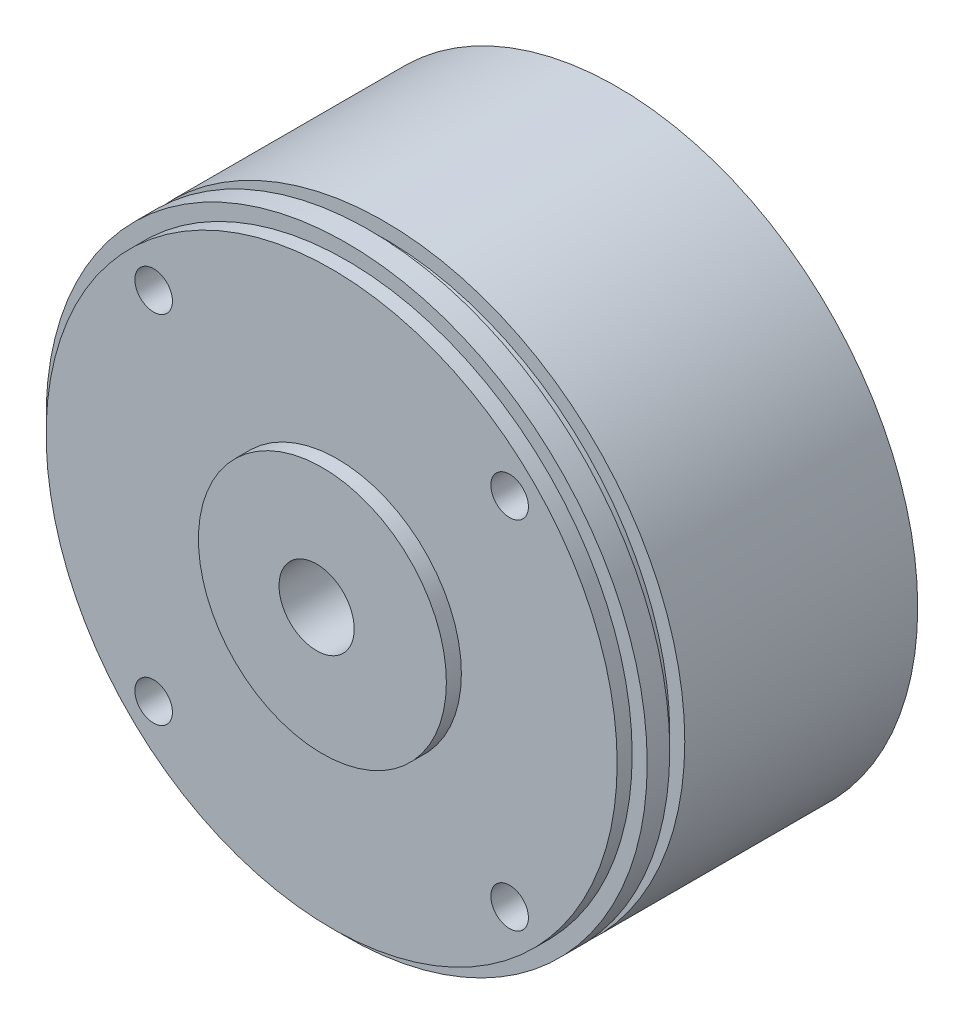
ISO-10303-21;
HEADER;
FILE_DESCRIPTION(('STEP AP214'),'2;1');
FILE_NAME('part.step','',(''),(''),'','','');
FILE_SCHEMA(('AUTOMOTIVE_DESIGN { 1 0 10303 214 1 1 1 1 }'));
ENDSEC;
DATA;
#1=APPLICATION_CONTEXT('core data for automotive mechanical design processes');
#2=APPLICATION_PROTOCOL_DEFINITION('international standard','automotive_design',2000,#1);
#3=PRODUCT_CONTEXT('',#1,'mechanical');
#4=PRODUCT('Part','Part','',(#3));
#5=PRODUCT_RELATED_PRODUCT_CATEGORY('part','',(#4));
#6=PRODUCT_DEFINITION_FORMATION('','',#4);
#7=PRODUCT_DEFINITION_CONTEXT('part definition',#1,'design');
#8=PRODUCT_DEFINITION('design','',#6,#7);
#9=PRODUCT_DEFINITION_SHAPE('','',#8);
#10=(LENGTH_UNIT() NAMED_UNIT(*) SI_UNIT(.MILLI.,.METRE.));
#11=(NAMED_UNIT(*) PLANE_ANGLE_UNIT() SI_UNIT($,.RADIAN.));
#12=(NAMED_UNIT(*) SI_UNIT($,.STERADIAN.) SOLID_ANGLE_UNIT());
#13=UNCERTAINTY_MEASURE_WITH_UNIT(LENGTH_MEASURE(1.E-05),#10,'distance_accuracy_value','');
#14=(GEOMETRIC_REPRESENTATION_CONTEXT(3) GLOBAL_UNCERTAINTY_ASSIGNED_CONTEXT((#13)) GLOBAL_UNIT_ASSIGNED_CONTEXT((#10,
#11,#12)) REPRESENTATION_CONTEXT('',''));
#15=CARTESIAN_POINT('',(0.,0.,0.));
#16=DIRECTION('',(0.,0.,1.));
#17=DIRECTION('',(1.,0.,0.));
#18=AXIS2_PLACEMENT_3D('',#15,#16,#17);
#19=CARTESIAN_POINT('',(0.,0.,20.));
#20=DIRECTION('',(0.,0.,-1.));
#21=DIRECTION('',(-1.,0.,0.));
#22=AXIS2_PLACEMENT_3D('',#19,#20,#21);
#23=CYLINDRICAL_SURFACE('',#22,20.);
#24=CARTESIAN_POINT('',(0.,0.,0.));
#25=DIRECTION('',(0.,0.,1.));
#26=DIRECTION('',(1.,0.,0.));
#27=AXIS2_PLACEMENT_3D('',#24,#25,#26);
#28=CIRCLE('',#27,20.);
#29=CARTESIAN_POINT('',(20.,0.,0.));
#30=VERTEX_POINT('',#29);
#31=EDGE_CURVE('E10',#30,#30,#28,.T.);
#32=ORIENTED_EDGE('',*,*,#31,.T.);
#33=EDGE_LOOP('',(#32));
#34=FACE_BOUND('',#33,.T.);
#35=CARTESIAN_POINT('',(0.,0.,15.5));
#36=DIRECTION('',(0.,0.,1.));
#37=DIRECTION('',(1.,0.,0.));
#38=AXIS2_PLACEMENT_3D('',#35,#36,#37);
#39=CIRCLE('',#38,20.);
#40=CARTESIAN_POINT('',(20.,0.,15.5));
#41=VERTEX_POINT('',#40);
#42=EDGE_CURVE('E111',#41,#41,#39,.T.);
#43=ORIENTED_EDGE('',*,*,#42,.F.);
#44=EDGE_LOOP('',(#43));
#45=FACE_BOUND('',#44,.T.);
#46=ADVANCED_FACE('F39',(#34,#45),#23,.T.);
#47=CARTESIAN_POINT('',(0.,0.,0.));
#48=DIRECTION('',(0.,0.,1.));
#49=DIRECTION('',(1.,0.,0.));
#50=AXIS2_PLACEMENT_3D('',#47,#48,#49);
#51=PLANE('',#50);
#52=CARTESIAN_POINT('',(0.,0.,0.));
#53=DIRECTION('',(0.,0.,1.));
#54=DIRECTION('',(1.,0.,0.));
#55=AXIS2_PLACEMENT_3D('',#52,#53,#54);
#56=CIRCLE('',#55,15.);
#57=CARTESIAN_POINT('',(15.,0.,0.));
#58=VERTEX_POINT('',#57);
#59=EDGE_CURVE('E54',#58,#58,#56,.T.);
#60=ORIENTED_EDGE('',*,*,#59,.T.);
#61=EDGE_LOOP('',(#60));
#62=FACE_BOUND('',#61,.T.);
#63=ORIENTED_EDGE('',*,*,#31,.F.);
#64=EDGE_LOOP('',(#63));
#65=FACE_BOUND('',#64,.T.);
#66=ADVANCED_FACE('F165',(#62,#65),#51,.F.);
#67=CARTESIAN_POINT('',(0.,0.,-0.5));
#68=DIRECTION('',(0.,0.,1.));
#69=DIRECTION('',(1.,0.,0.));
#70=AXIS2_PLACEMENT_3D('',#67,#68,#69);
#71=CYLINDRICAL_SURFACE('',#70,15.);
#72=CARTESIAN_POINT('',(0.,0.,-0.5));
#73=DIRECTION('',(0.,0.,1.));
#74=DIRECTION('',(1.,0.,0.));
#75=AXIS2_PLACEMENT_3D('',#72,#73,#74);
#76=CIRCLE('',#75,15.);
#77=CARTESIAN_POINT('',(15.,0.,-0.5));
#78=VERTEX_POINT('',#77);
#79=EDGE_CURVE('E48',#78,#78,#76,.T.);
#80=ORIENTED_EDGE('',*,*,#79,.T.);
#81=EDGE_LOOP('',(#80));
#82=FACE_BOUND('',#81,.T.);
#83=ORIENTED_EDGE('',*,*,#59,.F.);
#84=EDGE_LOOP('',(#83));
#85=FACE_BOUND('',#84,.T.);
#86=ADVANCED_FACE('F169',(#82,#85),#71,.T.);
#87=CARTESIAN_POINT('',(0.,0.,-0.5));
#88=DIRECTION('',(0.,0.,1.));
#89=DIRECTION('',(1.,0.,0.));
#90=AXIS2_PLACEMENT_3D('',#87,#88,#89);
#91=PLANE('',#90);
#92=CARTESIAN_POINT('',(0.,0.,-0.5));
#93=DIRECTION('',(0.,0.,1.));
#94=DIRECTION('',(1.,0.,0.));
#95=AXIS2_PLACEMENT_3D('',#92,#93,#94);
#96=CIRCLE('',#95,6.3);
#97=CARTESIAN_POINT('',(6.3,0.,-0.5));
#98=VERTEX_POINT('',#97);
#99=EDGE_CURVE('E279',#98,#98,#96,.T.);
#100=ORIENTED_EDGE('',*,*,#99,.T.);
#101=EDGE_LOOP('',(#100));
#102=FACE_BOUND('',#101,.T.);
#103=CARTESIAN_POINT('',(0.,10.,-0.5));
#104=DIRECTION('',(0.,0.,1.));
#105=DIRECTION('',(1.,0.,0.));
#106=AXIS2_PLACEMENT_3D('',#103,#104,#105);
#107=CIRCLE('',#106,1.5);
#108=CARTESIAN_POINT('',(1.5,10.,-0.5));
#109=VERTEX_POINT('',#108);
#110=EDGE_CURVE('E71',#109,#109,#107,.T.);
#111=ORIENTED_EDGE('',*,*,#110,.T.);
#112=EDGE_LOOP('',(#111));
#113=FACE_BOUND('',#112,.T.);
#114=CARTESIAN_POINT('',(10.0000000000003,2.82380124105319E-13,-0.5));
#115=DIRECTION('',(0.,0.,1.));
#116=DIRECTION('',(1.,0.,0.));
#117=AXIS2_PLACEMENT_3D('',#114,#115,#116);
#118=CIRCLE('',#117,1.50000000000022);
#119=CARTESIAN_POINT('',(11.5000000000005,2.82380124105319E-13,-0.5));
#120=VERTEX_POINT('',#119);
#121=EDGE_CURVE('E67',#120,#120,#118,.T.);
#122=ORIENTED_EDGE('',*,*,#121,.T.);
#123=EDGE_LOOP('',(#122));
#124=FACE_BOUND('',#123,.T.);
#125=CARTESIAN_POINT('',(5.64760248210638E-13,-10.,-0.5));
#126=DIRECTION('',(0.,0.,1.));
#127=DIRECTION('',(1.,0.,0.));
#128=AXIS2_PLACEMENT_3D('',#125,#126,#127);
#129=CIRCLE('',#128,1.50000000000061);
#130=CARTESIAN_POINT('',(1.50000000000117,-10.,-0.5));
#131=VERTEX_POINT('',#130);
#132=EDGE_CURVE('E62',#131,#131,#129,.T.);
#133=ORIENTED_EDGE('',*,*,#132,.T.);
#134=EDGE_LOOP('',(#133));
#135=FACE_BOUND('',#134,.T.);
#136=CARTESIAN_POINT('',(-9.99999999999972,-2.83604770904466E-13,-0.5));
#137=DIRECTION('',(0.,0.,1.));
#138=DIRECTION('',(1.,0.,0.));
#139=AXIS2_PLACEMENT_3D('',#136,#137,#138);
#140=CIRCLE('',#139,1.50000000000045);
#141=CARTESIAN_POINT('',(-8.49999999999927,-2.83604770904466E-13,-0.5));
#142=VERTEX_POINT('',#141);
#143=EDGE_CURVE('E58',#142,#142,#140,.T.);
#144=ORIENTED_EDGE('',*,*,#143,.T.);
#145=EDGE_LOOP('',(#144));
#146=FACE_BOUND('',#145,.T.);
#147=ORIENTED_EDGE('',*,*,#79,.F.);
#148=EDGE_LOOP('',(#147));
#149=FACE_BOUND('',#148,.T.);
#150=ADVANCED_FACE('F162',(#102,#113,#124,#135,#146,#149),#91,.F.);
#151=CARTESIAN_POINT('',(-9.99999999999972,-2.83604770904466E-13,-4.));
#152=DIRECTION('',(0.,0.,1.));
#153=DIRECTION('',(1.,0.,0.));
#154=AXIS2_PLACEMENT_3D('',#151,#152,#153);
#155=CYLINDRICAL_SURFACE('',#154,1.50000000000045);
#156=CARTESIAN_POINT('',(-9.99999999999972,-2.83604770904466E-13,4.));
#157=DIRECTION('',(0.,0.,1.));
#158=DIRECTION('',(1.,0.,0.));
#159=AXIS2_PLACEMENT_3D('',#156,#157,#158);
#160=CIRCLE('',#159,1.50000000000045);
#161=CARTESIAN_POINT('',(-8.49999999999927,-2.83604770904466E-13,4.));
#162=VERTEX_POINT('',#161);
#163=EDGE_CURVE('E129',#162,#162,#160,.T.);
#164=ORIENTED_EDGE('',*,*,#163,.T.);
#165=EDGE_LOOP('',(#164));
#166=FACE_BOUND('',#165,.T.);
#167=ORIENTED_EDGE('',*,*,#143,.F.);
#168=EDGE_LOOP('',(#167));
#169=FACE_BOUND('',#168,.T.);
#170=ADVANCED_FACE('F148',(#166,#169),#155,.F.);
#171=CARTESIAN_POINT('',(-9.99999999999972,-2.83604770904466E-13,4.));
#172=DIRECTION('',(0.,0.,1.));
#173=DIRECTION('',(1.,0.,0.));
#174=AXIS2_PLACEMENT_3D('',#171,#172,#173);
#175=PLANE('',#174);
#176=ORIENTED_EDGE('',*,*,#163,.F.);
#177=EDGE_LOOP('',(#176));
#178=FACE_BOUND('',#177,.T.);
#179=ADVANCED_FACE('F151',(#178),#175,.F.);
#180=CARTESIAN_POINT('',(5.64760248210638E-13,-10.,-4.));
#181=DIRECTION('',(0.,0.,1.));
#182=DIRECTION('',(1.,0.,0.));
#183=AXIS2_PLACEMENT_3D('',#180,#181,#182);
#184=CYLINDRICAL_SURFACE('',#183,1.50000000000061);
#185=CARTESIAN_POINT('',(5.64760248210638E-13,-10.,4.));
#186=DIRECTION('',(0.,0.,1.));
#187=DIRECTION('',(1.,0.,0.));
#188=AXIS2_PLACEMENT_3D('',#185,#186,#187);
#189=CIRCLE('',#188,1.50000000000061);
#190=CARTESIAN_POINT('',(1.50000000000117,-10.,4.));
#191=VERTEX_POINT('',#190);
#192=EDGE_CURVE('E140',#191,#191,#189,.T.);
#193=ORIENTED_EDGE('',*,*,#192,.T.);
#194=EDGE_LOOP('',(#193));
#195=FACE_BOUND('',#194,.T.);
#196=ORIENTED_EDGE('',*,*,#132,.F.);
#197=EDGE_LOOP('',(#196));
#198=FACE_BOUND('',#197,.T.);
#199=ADVANCED_FACE('F153',(#195,#198),#184,.F.);
#200=CARTESIAN_POINT('',(5.64760248210638E-13,-10.,4.));
#201=DIRECTION('',(0.,0.,1.));
#202=DIRECTION('',(1.,0.,0.));
#203=AXIS2_PLACEMENT_3D('',#200,#201,#202);
#204=PLANE('',#203);
#205=ORIENTED_EDGE('',*,*,#192,.F.);
#206=EDGE_LOOP('',(#205));
#207=FACE_BOUND('',#206,.T.);
#208=ADVANCED_FACE('F159',(#207),#204,.F.);
#209=CARTESIAN_POINT('',(10.0000000000003,2.82380124105319E-13,-4.));
#210=DIRECTION('',(0.,0.,1.));
#211=DIRECTION('',(1.,0.,0.));
#212=AXIS2_PLACEMENT_3D('',#209,#210,#211);
#213=CYLINDRICAL_SURFACE('',#212,1.50000000000022);
#214=CARTESIAN_POINT('',(10.0000000000003,2.82380124105319E-13,4.));
#215=DIRECTION('',(0.,0.,1.));
#216=DIRECTION('',(1.,0.,0.));
#217=AXIS2_PLACEMENT_3D('',#214,#215,#216);
#218=CIRCLE('',#217,1.50000000000022);
#219=CARTESIAN_POINT('',(11.5000000000005,2.82380124105319E-13,4.));
#220=VERTEX_POINT('',#219);
#221=EDGE_CURVE('E136',#220,#220,#218,.T.);
#222=ORIENTED_EDGE('',*,*,#221,.T.);
#223=EDGE_LOOP('',(#222));
#224=FACE_BOUND('',#223,.T.);
#225=ORIENTED_EDGE('',*,*,#121,.F.);
#226=EDGE_LOOP('',(#225));
#227=FACE_BOUND('',#226,.T.);
#228=ADVANCED_FACE('F228',(#224,#227),#213,.F.);
#229=CARTESIAN_POINT('',(10.0000000000003,2.82380124105319E-13,4.));
#230=DIRECTION('',(0.,0.,1.));
#231=DIRECTION('',(1.,0.,0.));
#232=AXIS2_PLACEMENT_3D('',#229,#230,#231);
#233=PLANE('',#232);
#234=ORIENTED_EDGE('',*,*,#221,.F.);
#235=EDGE_LOOP('',(#234));
#236=FACE_BOUND('',#235,.T.);
#237=ADVANCED_FACE('F224',(#236),#233,.F.);
#238=CARTESIAN_POINT('',(0.,10.,-4.));
#239=DIRECTION('',(0.,0.,1.));
#240=DIRECTION('',(1.,0.,0.));
#241=AXIS2_PLACEMENT_3D('',#238,#239,#240);
#242=CYLINDRICAL_SURFACE('',#241,1.5);
#243=CARTESIAN_POINT('',(0.,10.,4.));
#244=DIRECTION('',(0.,0.,1.));
#245=DIRECTION('',(1.,0.,0.));
#246=AXIS2_PLACEMENT_3D('',#243,#244,#245);
#247=CIRCLE('',#246,1.5);
#248=CARTESIAN_POINT('',(1.5,10.,4.));
#249=VERTEX_POINT('',#248);
#250=EDGE_CURVE('E63',#249,#249,#247,.T.);
#251=ORIENTED_EDGE('',*,*,#250,.T.);
#252=EDGE_LOOP('',(#251));
#253=FACE_BOUND('',#252,.T.);
#254=ORIENTED_EDGE('',*,*,#110,.F.);
#255=EDGE_LOOP('',(#254));
#256=FACE_BOUND('',#255,.T.);
#257=ADVANCED_FACE('F220',(#253,#256),#242,.F.);
#258=CARTESIAN_POINT('',(0.,10.,4.));
#259=DIRECTION('',(0.,0.,1.));
#260=DIRECTION('',(1.,0.,0.));
#261=AXIS2_PLACEMENT_3D('',#258,#259,#260);
#262=PLANE('',#261);
#263=ORIENTED_EDGE('',*,*,#250,.F.);
#264=EDGE_LOOP('',(#263));
#265=FACE_BOUND('',#264,.T.);
#266=ADVANCED_FACE('F203',(#265),#262,.F.);
#267=CARTESIAN_POINT('',(0.,0.,15.5));
#268=DIRECTION('',(0.,0.,1.));
#269=DIRECTION('',(1.,0.,0.));
#270=AXIS2_PLACEMENT_3D('',#267,#268,#269);
#271=PLANE('',#270);
#272=CARTESIAN_POINT('',(0.,0.,15.5));
#273=DIRECTION('',(0.,0.,1.));
#274=DIRECTION('',(1.,0.,0.));
#275=AXIS2_PLACEMENT_3D('',#272,#273,#274);
#276=CIRCLE('',#275,19.);
#277=CARTESIAN_POINT('',(19.,0.,15.5));
#278=VERTEX_POINT('',#277);
#279=EDGE_CURVE('E101',#278,#278,#276,.T.);
#280=ORIENTED_EDGE('',*,*,#279,.F.);
#281=EDGE_LOOP('',(#280));
#282=FACE_BOUND('',#281,.T.);
#283=ORIENTED_EDGE('',*,*,#42,.T.);
#284=EDGE_LOOP('',(#283));
#285=FACE_BOUND('',#284,.T.);
#286=ADVANCED_FACE('F194',(#282,#285),#271,.T.);
#287=CARTESIAN_POINT('',(0.,0.,16.5));
#288=DIRECTION('',(0.,0.,1.));
#289=DIRECTION('',(1.,0.,0.));
#290=AXIS2_PLACEMENT_3D('',#287,#288,#289);
#291=PLANE('',#290);
#292=CARTESIAN_POINT('',(0.,0.,16.5));
#293=DIRECTION('',(0.,0.,1.));
#294=DIRECTION('',(1.,0.,0.));
#295=AXIS2_PLACEMENT_3D('',#292,#293,#294);
#296=CIRCLE('',#295,19.);
#297=CARTESIAN_POINT('',(19.,0.,16.5));
#298=VERTEX_POINT('',#297);
#299=EDGE_CURVE('E96',#298,#298,#296,.T.);
#300=ORIENTED_EDGE('',*,*,#299,.T.);
#301=EDGE_LOOP('',(#300));
#302=FACE_BOUND('',#301,.T.);
#303=CARTESIAN_POINT('',(0.,0.,16.5));
#304=DIRECTION('',(0.,0.,1.));
#305=DIRECTION('',(1.,0.,0.));
#306=AXIS2_PLACEMENT_3D('',#303,#304,#305);
#307=CIRCLE('',#306,20.);
#308=CARTESIAN_POINT('',(20.,0.,16.5));
#309=VERTEX_POINT('',#308);
#310=EDGE_CURVE('E107',#309,#309,#307,.T.);
#311=ORIENTED_EDGE('',*,*,#310,.F.);
#312=EDGE_LOOP('',(#311));
#313=FACE_BOUND('',#312,.T.);
#314=ADVANCED_FACE('F191',(#302,#313),#291,.F.);
#315=CARTESIAN_POINT('',(0.,0.,15.5));
#316=DIRECTION('',(0.,0.,1.));
#317=DIRECTION('',(1.,0.,0.));
#318=AXIS2_PLACEMENT_3D('',#315,#316,#317);
#319=CYLINDRICAL_SURFACE('',#318,19.);
#320=ORIENTED_EDGE('',*,*,#279,.T.);
#321=EDGE_LOOP('',(#320));
#322=FACE_BOUND('',#321,.T.);
#323=ORIENTED_EDGE('',*,*,#299,.F.);
#324=EDGE_LOOP('',(#323));
#325=FACE_BOUND('',#324,.T.);
#326=ADVANCED_FACE('F193',(#322,#325),#319,.T.);
#327=CARTESIAN_POINT('',(0.,0.,20.));
#328=DIRECTION('',(0.,0.,1.));
#329=DIRECTION('',(1.,0.,0.));
#330=AXIS2_PLACEMENT_3D('',#327,#328,#329);
#331=PLANE('',#330);
#332=CARTESIAN_POINT('',(0.,0.,20.));
#333=DIRECTION('',(0.,0.,1.));
#334=DIRECTION('',(1.,0.,0.));
#335=AXIS2_PLACEMENT_3D('',#332,#333,#334);
#336=CIRCLE('',#335,2.5);
#337=CARTESIAN_POINT('',(2.5,0.,20.));
#338=VERTEX_POINT('',#337);
#339=EDGE_CURVE('E266',#338,#338,#336,.T.);
#340=ORIENTED_EDGE('',*,*,#339,.F.);
#341=EDGE_LOOP('',(#340));
#342=FACE_BOUND('',#341,.T.);
#343=CARTESIAN_POINT('',(0.385039993021148,0.,20.));
#344=DIRECTION('',(0.,0.,1.));
#345=DIRECTION('',(1.,0.,0.));
#346=AXIS2_PLACEMENT_3D('',#343,#344,#345);
#347=CIRCLE('',#346,8.25);
#348=CARTESIAN_POINT('',(8.63503999302115,0.,20.));
#349=VERTEX_POINT('',#348);
#350=EDGE_CURVE('E79',#349,#349,#347,.T.);
#351=ORIENTED_EDGE('',*,*,#350,.T.);
#352=EDGE_LOOP('',(#351));
#353=FACE_BOUND('',#352,.T.);
#354=ADVANCED_FACE('F200',(#342,#353),#331,.T.);
#355=CARTESIAN_POINT('',(0.385039993021148,0.,19.));
#356=DIRECTION('',(0.,0.,1.));
#357=DIRECTION('',(1.,0.,0.));
#358=AXIS2_PLACEMENT_3D('',#355,#356,#357);
#359=CYLINDRICAL_SURFACE('',#358,8.25);
#360=CARTESIAN_POINT('',(0.385039993021148,0.,19.));
#361=DIRECTION('',(0.,0.,1.));
#362=DIRECTION('',(1.,0.,0.));
#363=AXIS2_PLACEMENT_3D('',#360,#361,#362);
#364=CIRCLE('',#363,8.25);
#365=CARTESIAN_POINT('',(8.63503999302115,0.,19.));
#366=VERTEX_POINT('',#365);
#367=EDGE_CURVE('E125',#366,#366,#364,.T.);
#368=ORIENTED_EDGE('',*,*,#367,.T.);
#369=EDGE_LOOP('',(#368));
#370=FACE_BOUND('',#369,.T.);
#371=ORIENTED_EDGE('',*,*,#350,.F.);
#372=EDGE_LOOP('',(#371));
#373=FACE_BOUND('',#372,.T.);
#374=ADVANCED_FACE('F211',(#370,#373),#359,.T.);
#375=CARTESIAN_POINT('',(0.,0.,19.));
#376=DIRECTION('',(0.,0.,1.));
#377=DIRECTION('',(1.,0.,0.));
#378=AXIS2_PLACEMENT_3D('',#375,#376,#377);
#379=PLANE('',#378);
#380=CARTESIAN_POINT('',(11.8440385848745,-11.8440385848748,19.));
#381=DIRECTION('',(0.,0.,1.));
#382=DIRECTION('',(1.,0.,0.));
#383=AXIS2_PLACEMENT_3D('',#380,#381,#382);
#384=CIRCLE('',#383,1.25);
#385=CARTESIAN_POINT('',(13.0940385848745,-11.8440385848748,19.));
#386=VERTEX_POINT('',#385);
#387=EDGE_CURVE('E93',#386,#386,#384,.T.);
#388=ORIENTED_EDGE('',*,*,#387,.F.);
#389=EDGE_LOOP('',(#388));
#390=FACE_BOUND('',#389,.T.);
#391=CARTESIAN_POINT('',(11.8440385848748,11.8440385848746,19.));
#392=DIRECTION('',(0.,0.,1.));
#393=DIRECTION('',(1.,0.,0.));
#394=AXIS2_PLACEMENT_3D('',#391,#392,#393);
#395=CIRCLE('',#394,1.25);
#396=CARTESIAN_POINT('',(13.0940385848748,11.8440385848746,19.));
#397=VERTEX_POINT('',#396);
#398=EDGE_CURVE('E90',#397,#397,#395,.T.);
#399=ORIENTED_EDGE('',*,*,#398,.F.);
#400=EDGE_LOOP('',(#399));
#401=FACE_BOUND('',#400,.T.);
#402=CARTESIAN_POINT('',(-11.8440385848746,11.8440385848747,19.));
#403=DIRECTION('',(0.,0.,1.));
#404=DIRECTION('',(1.,0.,0.));
#405=AXIS2_PLACEMENT_3D('',#402,#403,#404);
#406=CIRCLE('',#405,1.25);
#407=CARTESIAN_POINT('',(-10.5940385848746,11.8440385848747,19.));
#408=VERTEX_POINT('',#407);
#409=EDGE_CURVE('E85',#408,#408,#406,.T.);
#410=ORIENTED_EDGE('',*,*,#409,.F.);
#411=EDGE_LOOP('',(#410));
#412=FACE_BOUND('',#411,.T.);
#413=CARTESIAN_POINT('',(-11.8440385848747,-11.8440385848747,19.));
#414=DIRECTION('',(0.,0.,1.));
#415=DIRECTION('',(1.,0.,0.));
#416=AXIS2_PLACEMENT_3D('',#413,#414,#415);
#417=CIRCLE('',#416,1.25);
#418=CARTESIAN_POINT('',(-10.5940385848747,-11.8440385848747,19.));
#419=VERTEX_POINT('',#418);
#420=EDGE_CURVE('E81',#419,#419,#417,.T.);
#421=ORIENTED_EDGE('',*,*,#420,.F.);
#422=EDGE_LOOP('',(#421));
#423=FACE_BOUND('',#422,.T.);
#424=ORIENTED_EDGE('',*,*,#367,.F.);
#425=EDGE_LOOP('',(#424));
#426=FACE_BOUND('',#425,.T.);
#427=CARTESIAN_POINT('',(0.,0.,19.));
#428=DIRECTION('',(0.,0.,1.));
#429=DIRECTION('',(1.,0.,0.));
#430=AXIS2_PLACEMENT_3D('',#427,#428,#429);
#431=CIRCLE('',#430,19.);
#432=CARTESIAN_POINT('',(19.,0.,19.));
#433=VERTEX_POINT('',#432);
#434=EDGE_CURVE('E75',#433,#433,#431,.T.);
#435=ORIENTED_EDGE('',*,*,#434,.T.);
#436=EDGE_LOOP('',(#435));
#437=FACE_BOUND('',#436,.T.);
#438=ADVANCED_FACE('F208',(#390,#401,#412,#423,#426,#437),#379,.T.);
#439=CARTESIAN_POINT('',(0.,0.,18.));
#440=DIRECTION('',(0.,0.,1.));
#441=DIRECTION('',(1.,0.,0.));
#442=AXIS2_PLACEMENT_3D('',#439,#440,#441);
#443=CYLINDRICAL_SURFACE('',#442,19.);
#444=ORIENTED_EDGE('',*,*,#434,.F.);
#445=EDGE_LOOP('',(#444));
#446=FACE_BOUND('',#445,.T.);
#447=CARTESIAN_POINT('',(0.,0.,18.));
#448=DIRECTION('',(0.,0.,1.));
#449=DIRECTION('',(1.,0.,0.));
#450=AXIS2_PLACEMENT_3D('',#447,#448,#449);
#451=CIRCLE('',#450,19.);
#452=CARTESIAN_POINT('',(19.,0.,18.));
#453=VERTEX_POINT('',#452);
#454=EDGE_CURVE('E115',#453,#453,#451,.T.);
#455=ORIENTED_EDGE('',*,*,#454,.T.);
#456=EDGE_LOOP('',(#455));
#457=FACE_BOUND('',#456,.T.);
#458=ADVANCED_FACE('F183',(#446,#457),#443,.T.);
#459=CARTESIAN_POINT('',(0.,0.,18.));
#460=DIRECTION('',(0.,0.,1.));
#461=DIRECTION('',(1.,0.,0.));
#462=AXIS2_PLACEMENT_3D('',#459,#460,#461);
#463=PLANE('',#462);
#464=ORIENTED_EDGE('',*,*,#454,.F.);
#465=EDGE_LOOP('',(#464));
#466=FACE_BOUND('',#465,.T.);
#467=CARTESIAN_POINT('',(0.,0.,18.));
#468=DIRECTION('',(0.,0.,1.));
#469=DIRECTION('',(1.,0.,0.));
#470=AXIS2_PLACEMENT_3D('',#467,#468,#469);
#471=CIRCLE('',#470,20.);
#472=CARTESIAN_POINT('',(20.,0.,18.));
#473=VERTEX_POINT('',#472);
#474=EDGE_CURVE('E80',#473,#473,#471,.T.);
#475=ORIENTED_EDGE('',*,*,#474,.T.);
#476=EDGE_LOOP('',(#475));
#477=FACE_BOUND('',#476,.T.);
#478=ADVANCED_FACE('F174',(#466,#477),#463,.T.);
#479=ORIENTED_EDGE('',*,*,#310,.T.);
#480=EDGE_LOOP('',(#479));
#481=FACE_BOUND('',#480,.T.);
#482=ORIENTED_EDGE('',*,*,#474,.F.);
#483=EDGE_LOOP('',(#482));
#484=FACE_BOUND('',#483,.T.);
#485=ADVANCED_FACE('F41',(#481,#484),#23,.T.);
#486=CARTESIAN_POINT('',(-11.8440385848747,-11.8440385848747,15.));
#487=DIRECTION('',(0.,0.,1.));
#488=DIRECTION('',(1.,0.,0.));
#489=AXIS2_PLACEMENT_3D('',#486,#487,#488);
#490=CYLINDRICAL_SURFACE('',#489,1.25);
#491=ORIENTED_EDGE('',*,*,#420,.T.);
#492=EDGE_LOOP('',(#491));
#493=FACE_BOUND('',#492,.T.);
#494=CARTESIAN_POINT('',(-11.8440385848747,-11.8440385848747,15.));
#495=DIRECTION('',(0.,0.,1.));
#496=DIRECTION('',(1.,0.,0.));
#497=AXIS2_PLACEMENT_3D('',#494,#495,#496);
#498=CIRCLE('',#497,1.25);
#499=CARTESIAN_POINT('',(-10.5940385848747,-11.8440385848747,15.));
#500=VERTEX_POINT('',#499);
#501=EDGE_CURVE('E86',#500,#500,#498,.T.);
#502=ORIENTED_EDGE('',*,*,#501,.F.);
#503=EDGE_LOOP('',(#502));
#504=FACE_BOUND('',#503,.T.);
#505=ADVANCED_FACE('F173',(#493,#504),#490,.F.);
#506=CARTESIAN_POINT('',(-11.8440385848747,-11.8440385848747,15.));
#507=DIRECTION('',(0.,0.,1.));
#508=DIRECTION('',(1.,0.,0.));
#509=AXIS2_PLACEMENT_3D('',#506,#507,#508);
#510=PLANE('',#509);
#511=ORIENTED_EDGE('',*,*,#501,.T.);
#512=EDGE_LOOP('',(#511));
#513=FACE_BOUND('',#512,.T.);
#514=ADVANCED_FACE('F180',(#513),#510,.T.);
#515=CARTESIAN_POINT('',(-11.8440385848746,11.8440385848747,15.));
#516=DIRECTION('',(0.,0.,1.));
#517=DIRECTION('',(1.,0.,0.));
#518=AXIS2_PLACEMENT_3D('',#515,#516,#517);
#519=CYLINDRICAL_SURFACE('',#518,1.25);
#520=ORIENTED_EDGE('',*,*,#409,.T.);
#521=EDGE_LOOP('',(#520));
#522=FACE_BOUND('',#521,.T.);
#523=CARTESIAN_POINT('',(-11.8440385848746,11.8440385848747,15.));
#524=DIRECTION('',(0.,0.,1.));
#525=DIRECTION('',(1.,0.,0.));
#526=AXIS2_PLACEMENT_3D('',#523,#524,#525);
#527=CIRCLE('',#526,1.25);
#528=CARTESIAN_POINT('',(-10.5940385848746,11.8440385848747,15.));
#529=VERTEX_POINT('',#528);
#530=EDGE_CURVE('E284',#529,#529,#527,.T.);
#531=ORIENTED_EDGE('',*,*,#530,.F.);
#532=EDGE_LOOP('',(#531));
#533=FACE_BOUND('',#532,.T.);
#534=ADVANCED_FACE('F300',(#522,#533),#519,.F.);
#535=CARTESIAN_POINT('',(-11.8440385848746,11.8440385848747,15.));
#536=DIRECTION('',(0.,0.,1.));
#537=DIRECTION('',(1.,0.,0.));
#538=AXIS2_PLACEMENT_3D('',#535,#536,#537);
#539=PLANE('',#538);
#540=ORIENTED_EDGE('',*,*,#530,.T.);
#541=EDGE_LOOP('',(#540));
#542=FACE_BOUND('',#541,.T.);
#543=ADVANCED_FACE('F305',(#542),#539,.T.);
#544=CARTESIAN_POINT('',(11.8440385848748,11.8440385848746,15.));
#545=DIRECTION('',(0.,0.,1.));
#546=DIRECTION('',(1.,0.,0.));
#547=AXIS2_PLACEMENT_3D('',#544,#545,#546);
#548=CYLINDRICAL_SURFACE('',#547,1.25);
#549=ORIENTED_EDGE('',*,*,#398,.T.);
#550=EDGE_LOOP('',(#549));
#551=FACE_BOUND('',#550,.T.);
#552=CARTESIAN_POINT('',(11.8440385848748,11.8440385848746,15.));
#553=DIRECTION('',(0.,0.,1.));
#554=DIRECTION('',(1.,0.,0.));
#555=AXIS2_PLACEMENT_3D('',#552,#553,#554);
#556=CIRCLE('',#555,1.25);
#557=CARTESIAN_POINT('',(13.0940385848748,11.8440385848746,15.));
#558=VERTEX_POINT('',#557);
#559=EDGE_CURVE('E288',#558,#558,#556,.T.);
#560=ORIENTED_EDGE('',*,*,#559,.F.);
#561=EDGE_LOOP('',(#560));
#562=FACE_BOUND('',#561,.T.);
#563=ADVANCED_FACE('F318',(#551,#562),#548,.F.);
#564=CARTESIAN_POINT('',(11.8440385848748,11.8440385848746,15.));
#565=DIRECTION('',(0.,0.,1.));
#566=DIRECTION('',(1.,0.,0.));
#567=AXIS2_PLACEMENT_3D('',#564,#565,#566);
#568=PLANE('',#567);
#569=ORIENTED_EDGE('',*,*,#559,.T.);
#570=EDGE_LOOP('',(#569));
#571=FACE_BOUND('',#570,.T.);
#572=ADVANCED_FACE('F313',(#571),#568,.T.);
#573=CARTESIAN_POINT('',(11.8440385848745,-11.8440385848748,15.));
#574=DIRECTION('',(0.,0.,1.));
#575=DIRECTION('',(1.,0.,0.));
#576=AXIS2_PLACEMENT_3D('',#573,#574,#575);
#577=CYLINDRICAL_SURFACE('',#576,1.25);
#578=ORIENTED_EDGE('',*,*,#387,.T.);
#579=EDGE_LOOP('',(#578));
#580=FACE_BOUND('',#579,.T.);
#581=CARTESIAN_POINT('',(11.8440385848745,-11.8440385848748,15.));
#582=DIRECTION('',(0.,0.,1.));
#583=DIRECTION('',(1.,0.,0.));
#584=AXIS2_PLACEMENT_3D('',#581,#582,#583);
#585=CIRCLE('',#584,1.25);
#586=CARTESIAN_POINT('',(13.0940385848745,-11.8440385848748,15.));
#587=VERTEX_POINT('',#586);
#588=EDGE_CURVE('E283',#587,#587,#585,.T.);
#589=ORIENTED_EDGE('',*,*,#588,.F.);
#590=EDGE_LOOP('',(#589));
#591=FACE_BOUND('',#590,.T.);
#592=ADVANCED_FACE('F309',(#580,#591),#577,.F.);
#593=CARTESIAN_POINT('',(11.8440385848745,-11.8440385848748,15.));
#594=DIRECTION('',(0.,0.,1.));
#595=DIRECTION('',(1.,0.,0.));
#596=AXIS2_PLACEMENT_3D('',#593,#594,#595);
#597=PLANE('',#596);
#598=ORIENTED_EDGE('',*,*,#588,.T.);
#599=EDGE_LOOP('',(#598));
#600=FACE_BOUND('',#599,.T.);
#601=ADVANCED_FACE('F312',(#600),#597,.T.);
#602=CARTESIAN_POINT('',(0.,0.,-0.5));
#603=DIRECTION('',(0.,0.,1.));
#604=DIRECTION('',(1.,0.,0.));
#605=AXIS2_PLACEMENT_3D('',#602,#603,#604);
#606=CYLINDRICAL_SURFACE('',#605,6.3);
#607=ORIENTED_EDGE('',*,*,#99,.F.);
#608=EDGE_LOOP('',(#607));
#609=FACE_BOUND('',#608,.T.);
#610=CARTESIAN_POINT('',(0.,0.,5.));
#611=DIRECTION('',(0.,0.,1.));
#612=DIRECTION('',(1.,0.,0.));
#613=AXIS2_PLACEMENT_3D('',#610,#611,#612);
#614=CIRCLE('',#613,6.3);
#615=CARTESIAN_POINT('',(6.3,0.,5.));
#616=VERTEX_POINT('',#615);
#617=EDGE_CURVE('E274',#616,#616,#614,.T.);
#618=ORIENTED_EDGE('',*,*,#617,.T.);
#619=EDGE_LOOP('',(#618));
#620=FACE_BOUND('',#619,.T.);
#621=ADVANCED_FACE('F316',(#609,#620),#606,.F.);
#622=CARTESIAN_POINT('',(0.,0.,5.));
#623=DIRECTION('',(0.,0.,1.));
#624=DIRECTION('',(1.,0.,0.));
#625=AXIS2_PLACEMENT_3D('',#622,#623,#624);
#626=PLANE('',#625);
#627=CARTESIAN_POINT('',(0.,0.,5.));
#628=DIRECTION('',(0.,0.,1.));
#629=DIRECTION('',(1.,0.,0.));
#630=AXIS2_PLACEMENT_3D('',#627,#628,#629);
#631=CIRCLE('',#630,2.5);
#632=CARTESIAN_POINT('',(2.5,0.,5.));
#633=VERTEX_POINT('',#632);
#634=EDGE_CURVE('E43',#633,#633,#631,.T.);
#635=ORIENTED_EDGE('',*,*,#634,.T.);
#636=EDGE_LOOP('',(#635));
#637=FACE_BOUND('',#636,.T.);
#638=ORIENTED_EDGE('',*,*,#617,.F.);
#639=EDGE_LOOP('',(#638));
#640=FACE_BOUND('',#639,.T.);
#641=ADVANCED_FACE('F330',(#637,#640),#626,.F.);
#642=CARTESIAN_POINT('',(0.,0.,-0.5));
#643=DIRECTION('',(0.,0.,1.));
#644=DIRECTION('',(1.,0.,0.));
#645=AXIS2_PLACEMENT_3D('',#642,#643,#644);
#646=CYLINDRICAL_SURFACE('',#645,2.5);
#647=ORIENTED_EDGE('',*,*,#339,.T.);
#648=EDGE_LOOP('',(#647));
#649=FACE_BOUND('',#648,.T.);
#650=ORIENTED_EDGE('',*,*,#634,.F.);
#651=EDGE_LOOP('',(#650));
#652=FACE_BOUND('',#651,.T.);
#653=ADVANCED_FACE('F334',(#649,#652),#646,.F.);
#654=CLOSED_SHELL('',(#46,#66,#86,#150,#170,#179,#199,#208,#228,#237,#257,#266,#286,#314,#326,
#354,#374,#438,#458,#478,#485,#505,#514,#534,#543,#563,#572,#592,#601,#621,#641,#653));
#655=MANIFOLD_SOLID_BREP('B2',#654);
#656=ADVANCED_BREP_SHAPE_REPRESENTATION('',(#18,#655),#14);
#657=SHAPE_DEFINITION_REPRESENTATION(#9,#656);
ENDSEC;
END-ISO-10303-21;
